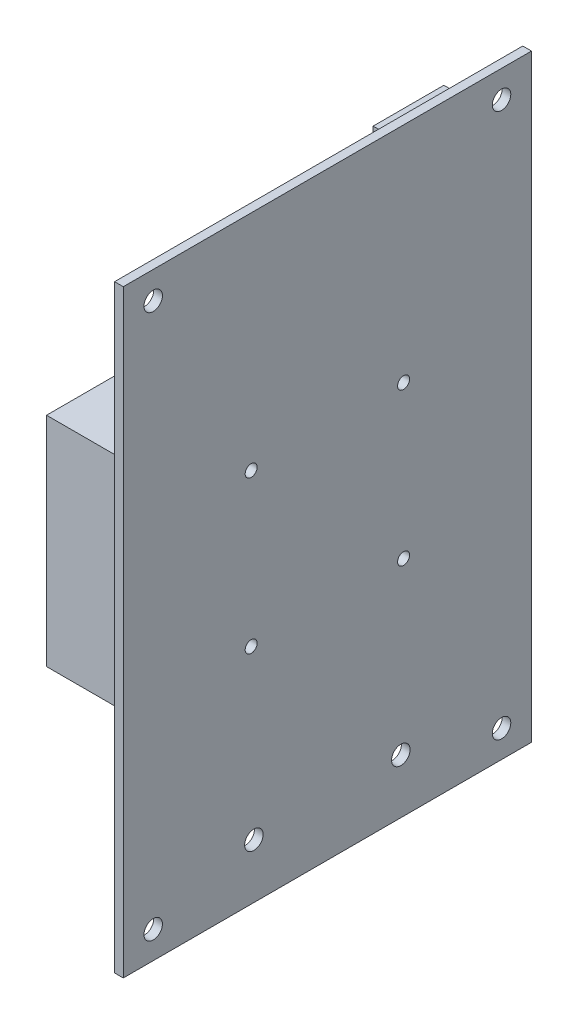
ISO-10303-21;
HEADER;
FILE_DESCRIPTION(('STEP AP214'),'2;1');
FILE_NAME('part.step','',(''),(''),'','','');
FILE_SCHEMA(('AUTOMOTIVE_DESIGN { 1 0 10303 214 1 1 1 1 }'));
ENDSEC;
DATA;
#1=APPLICATION_CONTEXT('core data for automotive mechanical design processes');
#2=APPLICATION_PROTOCOL_DEFINITION('international standard','automotive_design',2000,#1);
#3=PRODUCT_CONTEXT('',#1,'mechanical');
#4=PRODUCT('Part','Part','',(#3));
#5=PRODUCT_RELATED_PRODUCT_CATEGORY('part','',(#4));
#6=PRODUCT_DEFINITION_FORMATION('','',#4);
#7=PRODUCT_DEFINITION_CONTEXT('part definition',#1,'design');
#8=PRODUCT_DEFINITION('design','',#6,#7);
#9=PRODUCT_DEFINITION_SHAPE('','',#8);
#10=(LENGTH_UNIT() NAMED_UNIT(*) SI_UNIT(.MILLI.,.METRE.));
#11=(NAMED_UNIT(*) PLANE_ANGLE_UNIT() SI_UNIT($,.RADIAN.));
#12=(NAMED_UNIT(*) SI_UNIT($,.STERADIAN.) SOLID_ANGLE_UNIT());
#13=UNCERTAINTY_MEASURE_WITH_UNIT(LENGTH_MEASURE(1.E-05),#10,'distance_accuracy_value','');
#14=(GEOMETRIC_REPRESENTATION_CONTEXT(3) GLOBAL_UNCERTAINTY_ASSIGNED_CONTEXT((#13)) GLOBAL_UNIT_ASSIGNED_CONTEXT((#10,
#11,#12)) REPRESENTATION_CONTEXT('',''));
#15=CARTESIAN_POINT('',(0.,0.,0.));
#16=DIRECTION('',(0.,0.,1.));
#17=DIRECTION('',(1.,0.,0.));
#18=AXIS2_PLACEMENT_3D('',#15,#16,#17);
#19=CARTESIAN_POINT('',(-31.6,-55.,37.5));
#20=DIRECTION('',(0.,-1.,0.));
#21=DIRECTION('',(0.,0.,-1.));
#22=AXIS2_PLACEMENT_3D('',#19,#20,#21);
#23=PLANE('',#22);
#24=DIRECTION('',(0.,0.,-1.));
#25=VECTOR('',#24,1.);
#26=CARTESIAN_POINT('',(-30.,-55.,37.5));
#27=LINE('',#26,#25);
#28=CARTESIAN_POINT('',(-30.,-55.,37.5));
#29=VERTEX_POINT('',#28);
#30=CARTESIAN_POINT('',(-30.,-55.,-37.5));
#31=VERTEX_POINT('',#30);
#32=EDGE_CURVE('E314',#29,#31,#27,.T.);
#33=ORIENTED_EDGE('',*,*,#32,.F.);
#34=DIRECTION('',(1.,0.,0.));
#35=VECTOR('',#34,1.);
#36=CARTESIAN_POINT('',(-31.6,-55.,37.5));
#37=LINE('',#36,#35);
#38=CARTESIAN_POINT('',(-31.6,-55.,37.5));
#39=VERTEX_POINT('',#38);
#40=EDGE_CURVE('E11',#39,#29,#37,.T.);
#41=ORIENTED_EDGE('',*,*,#40,.F.);
#42=DIRECTION('',(0.,0.,-1.));
#43=VECTOR('',#42,1.);
#44=CARTESIAN_POINT('',(-31.6,-55.,37.5));
#45=LINE('',#44,#43);
#46=CARTESIAN_POINT('',(-31.6,-55.,-37.5));
#47=VERTEX_POINT('',#46);
#48=EDGE_CURVE('E319',#39,#47,#45,.T.);
#49=ORIENTED_EDGE('',*,*,#48,.T.);
#50=DIRECTION('',(1.,0.,0.));
#51=VECTOR('',#50,1.);
#52=CARTESIAN_POINT('',(-31.6,-55.,-37.5));
#53=LINE('',#52,#51);
#54=EDGE_CURVE('E42',#47,#31,#53,.T.);
#55=ORIENTED_EDGE('',*,*,#54,.T.);
#56=EDGE_LOOP('',(#33,#41,#49,#55));
#57=FACE_BOUND('',#56,.T.);
#58=ADVANCED_FACE('F41',(#57),#23,.T.);
#59=CARTESIAN_POINT('',(-31.6,55.,37.5));
#60=DIRECTION('',(0.,0.,1.));
#61=DIRECTION('',(1.,0.,0.));
#62=AXIS2_PLACEMENT_3D('',#59,#60,#61);
#63=PLANE('',#62);
#64=DIRECTION('',(0.,-1.,0.));
#65=VECTOR('',#64,1.);
#66=CARTESIAN_POINT('',(-30.,55.,37.5));
#67=LINE('',#66,#65);
#68=CARTESIAN_POINT('',(-30.,55.,37.5));
#69=VERTEX_POINT('',#68);
#70=EDGE_CURVE('E321',#69,#29,#67,.T.);
#71=ORIENTED_EDGE('',*,*,#70,.F.);
#72=DIRECTION('',(1.,0.,0.));
#73=VECTOR('',#72,1.);
#74=CARTESIAN_POINT('',(-31.6,55.,37.5));
#75=LINE('',#74,#73);
#76=CARTESIAN_POINT('',(-31.6,55.,37.5));
#77=VERTEX_POINT('',#76);
#78=EDGE_CURVE('E47',#77,#69,#75,.T.);
#79=ORIENTED_EDGE('',*,*,#78,.F.);
#80=DIRECTION('',(0.,-1.,0.));
#81=VECTOR('',#80,1.);
#82=CARTESIAN_POINT('',(-31.6,55.,37.5));
#83=LINE('',#82,#81);
#84=EDGE_CURVE('E327',#77,#39,#83,.T.);
#85=ORIENTED_EDGE('',*,*,#84,.T.);
#86=ORIENTED_EDGE('',*,*,#40,.T.);
#87=EDGE_LOOP('',(#71,#79,#85,#86));
#88=FACE_BOUND('',#87,.T.);
#89=ADVANCED_FACE('F354',(#88),#63,.T.);
#90=CARTESIAN_POINT('',(-31.6,55.,-37.5));
#91=DIRECTION('',(0.,1.,0.));
#92=DIRECTION('',(0.,0.,1.));
#93=AXIS2_PLACEMENT_3D('',#90,#91,#92);
#94=PLANE('',#93);
#95=DIRECTION('',(0.,0.,1.));
#96=VECTOR('',#95,1.);
#97=CARTESIAN_POINT('',(-30.,55.,-37.5));
#98=LINE('',#97,#96);
#99=CARTESIAN_POINT('',(-30.,55.,-37.5));
#100=VERTEX_POINT('',#99);
#101=EDGE_CURVE('E337',#100,#69,#98,.T.);
#102=ORIENTED_EDGE('',*,*,#101,.F.);
#103=DIRECTION('',(1.,0.,0.));
#104=VECTOR('',#103,1.);
#105=CARTESIAN_POINT('',(-31.6,55.,-37.5));
#106=LINE('',#105,#104);
#107=CARTESIAN_POINT('',(-31.6,55.,-37.5));
#108=VERTEX_POINT('',#107);
#109=EDGE_CURVE('E344',#108,#100,#106,.T.);
#110=ORIENTED_EDGE('',*,*,#109,.F.);
#111=DIRECTION('',(0.,0.,1.));
#112=VECTOR('',#111,1.);
#113=CARTESIAN_POINT('',(-31.6,55.,-37.5));
#114=LINE('',#113,#112);
#115=EDGE_CURVE('E322',#108,#77,#114,.T.);
#116=ORIENTED_EDGE('',*,*,#115,.T.);
#117=ORIENTED_EDGE('',*,*,#78,.T.);
#118=EDGE_LOOP('',(#102,#110,#116,#117));
#119=FACE_BOUND('',#118,.T.);
#120=ADVANCED_FACE('F359',(#119),#94,.T.);
#121=CARTESIAN_POINT('',(-31.6,-55.,-37.5));
#122=DIRECTION('',(0.,0.,-1.));
#123=DIRECTION('',(-1.,0.,0.));
#124=AXIS2_PLACEMENT_3D('',#121,#122,#123);
#125=PLANE('',#124);
#126=DIRECTION('',(0.,1.,0.));
#127=VECTOR('',#126,1.);
#128=CARTESIAN_POINT('',(-30.,-55.,-37.5));
#129=LINE('',#128,#127);
#130=EDGE_CURVE('E331',#31,#100,#129,.T.);
#131=ORIENTED_EDGE('',*,*,#130,.F.);
#132=ORIENTED_EDGE('',*,*,#54,.F.);
#133=DIRECTION('',(0.,1.,0.));
#134=VECTOR('',#133,1.);
#135=CARTESIAN_POINT('',(-31.6,-55.,-37.5));
#136=LINE('',#135,#134);
#137=EDGE_CURVE('E324',#47,#108,#136,.T.);
#138=ORIENTED_EDGE('',*,*,#137,.T.);
#139=ORIENTED_EDGE('',*,*,#109,.T.);
#140=EDGE_LOOP('',(#131,#132,#138,#139));
#141=FACE_BOUND('',#140,.T.);
#142=ADVANCED_FACE('F350',(#141),#125,.T.);
#143=CARTESIAN_POINT('',(-31.6,0.,0.));
#144=DIRECTION('',(1.,0.,0.));
#145=DIRECTION('',(0.,0.,-1.));
#146=AXIS2_PLACEMENT_3D('',#143,#144,#145);
#147=PLANE('',#146);
#148=DIRECTION('',(0.,-1.,0.));
#149=VECTOR('',#148,1.);
#150=CARTESIAN_POINT('',(-31.6,25.,35.));
#151=LINE('',#150,#149);
#152=CARTESIAN_POINT('',(-31.6,25.,35.));
#153=VERTEX_POINT('',#152);
#154=CARTESIAN_POINT('',(-31.6,-15.,35.));
#155=VERTEX_POINT('',#154);
#156=EDGE_CURVE('E177',#153,#155,#151,.T.);
#157=ORIENTED_EDGE('',*,*,#156,.T.);
#158=DIRECTION('',(0.,0.,-1.));
#159=VECTOR('',#158,1.);
#160=CARTESIAN_POINT('',(-31.6,-15.,35.));
#161=LINE('',#160,#159);
#162=CARTESIAN_POINT('',(-31.6,-15.,20.));
#163=VERTEX_POINT('',#162);
#164=EDGE_CURVE('E187',#155,#163,#161,.T.);
#165=ORIENTED_EDGE('',*,*,#164,.T.);
#166=DIRECTION('',(0.,1.,0.));
#167=VECTOR('',#166,1.);
#168=CARTESIAN_POINT('',(-31.6,-15.,20.));
#169=LINE('',#168,#167);
#170=CARTESIAN_POINT('',(-31.6,25.,20.));
#171=VERTEX_POINT('',#170);
#172=EDGE_CURVE('E159',#163,#171,#169,.T.);
#173=ORIENTED_EDGE('',*,*,#172,.T.);
#174=DIRECTION('',(0.,0.,1.));
#175=VECTOR('',#174,1.);
#176=CARTESIAN_POINT('',(-31.6,25.,20.));
#177=LINE('',#176,#175);
#178=EDGE_CURVE('E60',#171,#153,#177,.T.);
#179=ORIENTED_EDGE('',*,*,#178,.T.);
#180=EDGE_LOOP('',(#157,#165,#173,#179));
#181=FACE_BOUND('',#180,.T.);
#182=DIRECTION('',(0.,-1.,0.));
#183=VECTOR('',#182,1.);
#184=CARTESIAN_POINT('',(-31.6,53.,-13.));
#185=LINE('',#184,#183);
#186=CARTESIAN_POINT('',(-31.6,53.,-13.));
#187=VERTEX_POINT('',#186);
#188=CARTESIAN_POINT('',(-31.6,35.,-13.));
#189=VERTEX_POINT('',#188);
#190=EDGE_CURVE('E200',#187,#189,#185,.T.);
#191=ORIENTED_EDGE('',*,*,#190,.T.);
#192=DIRECTION('',(0.,0.,-1.));
#193=VECTOR('',#192,1.);
#194=CARTESIAN_POINT('',(-31.6,35.,-13.));
#195=LINE('',#194,#193);
#196=CARTESIAN_POINT('',(-31.6,35.,-26.));
#197=VERTEX_POINT('',#196);
#198=EDGE_CURVE('E194',#189,#197,#195,.T.);
#199=ORIENTED_EDGE('',*,*,#198,.T.);
#200=DIRECTION('',(0.,1.,0.));
#201=VECTOR('',#200,1.);
#202=CARTESIAN_POINT('',(-31.6,35.,-26.));
#203=LINE('',#202,#201);
#204=CARTESIAN_POINT('',(-31.6,53.,-26.));
#205=VERTEX_POINT('',#204);
#206=EDGE_CURVE('E214',#197,#205,#203,.T.);
#207=ORIENTED_EDGE('',*,*,#206,.T.);
#208=DIRECTION('',(0.,0.,1.));
#209=VECTOR('',#208,1.);
#210=CARTESIAN_POINT('',(-31.6,53.,-26.));
#211=LINE('',#210,#209);
#212=EDGE_CURVE('E62',#205,#187,#211,.T.);
#213=ORIENTED_EDGE('',*,*,#212,.T.);
#214=EDGE_LOOP('',(#191,#199,#207,#213));
#215=FACE_BOUND('',#214,.T.);
#216=DIRECTION('',(0.,-1.,0.));
#217=VECTOR('',#216,1.);
#218=CARTESIAN_POINT('',(-31.6,30.5,-19.));
#219=LINE('',#218,#217);
#220=CARTESIAN_POINT('',(-31.6,30.5,-19.));
#221=VERTEX_POINT('',#220);
#222=CARTESIAN_POINT('',(-31.6,-30.5,-19.));
#223=VERTEX_POINT('',#222);
#224=EDGE_CURVE('E230',#221,#223,#219,.T.);
#225=ORIENTED_EDGE('',*,*,#224,.T.);
#226=DIRECTION('',(0.,0.,-1.));
#227=VECTOR('',#226,1.);
#228=CARTESIAN_POINT('',(-31.6,-30.5,-19.));
#229=LINE('',#228,#227);
#230=CARTESIAN_POINT('',(-31.6,-30.5,-37.));
#231=VERTEX_POINT('',#230);
#232=EDGE_CURVE('E220',#223,#231,#229,.T.);
#233=ORIENTED_EDGE('',*,*,#232,.T.);
#234=DIRECTION('',(0.,1.,0.));
#235=VECTOR('',#234,1.);
#236=CARTESIAN_POINT('',(-31.6,-30.5,-37.));
#237=LINE('',#236,#235);
#238=CARTESIAN_POINT('',(-31.6,30.5,-37.));
#239=VERTEX_POINT('',#238);
#240=EDGE_CURVE('E241',#231,#239,#237,.T.);
#241=ORIENTED_EDGE('',*,*,#240,.T.);
#242=DIRECTION('',(0.,0.,1.));
#243=VECTOR('',#242,1.);
#244=CARTESIAN_POINT('',(-31.6,30.5,-37.));
#245=LINE('',#244,#243);
#246=EDGE_CURVE('E242',#239,#221,#245,.T.);
#247=ORIENTED_EDGE('',*,*,#246,.T.);
#248=EDGE_LOOP('',(#225,#233,#241,#247));
#249=FACE_BOUND('',#248,.T.);
#250=CARTESIAN_POINT('',(-31.6,14.,14.));
#251=DIRECTION('',(1.,0.,0.));
#252=DIRECTION('',(0.,0.,-1.));
#253=AXIS2_PLACEMENT_3D('',#250,#251,#252);
#254=CIRCLE('',#253,1.1);
#255=CARTESIAN_POINT('',(-31.6,14.,12.9));
#256=VERTEX_POINT('',#255);
#257=EDGE_CURVE('E260',#256,#256,#254,.T.);
#258=ORIENTED_EDGE('',*,*,#257,.T.);
#259=EDGE_LOOP('',(#258));
#260=FACE_BOUND('',#259,.T.);
#261=CARTESIAN_POINT('',(-31.6,14.,-14.));
#262=DIRECTION('',(1.,0.,0.));
#263=DIRECTION('',(0.,0.,-1.));
#264=AXIS2_PLACEMENT_3D('',#261,#262,#263);
#265=CIRCLE('',#264,1.1);
#266=CARTESIAN_POINT('',(-31.6,14.,-15.1));
#267=VERTEX_POINT('',#266);
#268=EDGE_CURVE('E265',#267,#267,#265,.T.);
#269=ORIENTED_EDGE('',*,*,#268,.T.);
#270=EDGE_LOOP('',(#269));
#271=FACE_BOUND('',#270,.T.);
#272=CARTESIAN_POINT('',(-31.6,-14.,14.));
#273=DIRECTION('',(1.,0.,0.));
#274=DIRECTION('',(0.,0.,-1.));
#275=AXIS2_PLACEMENT_3D('',#272,#273,#274);
#276=CIRCLE('',#275,1.1);
#277=CARTESIAN_POINT('',(-31.6,-14.,12.9));
#278=VERTEX_POINT('',#277);
#279=EDGE_CURVE('E267',#278,#278,#276,.T.);
#280=ORIENTED_EDGE('',*,*,#279,.T.);
#281=EDGE_LOOP('',(#280));
#282=FACE_BOUND('',#281,.T.);
#283=CARTESIAN_POINT('',(-31.6,-14.,-14.));
#284=DIRECTION('',(1.,0.,0.));
#285=DIRECTION('',(0.,0.,-1.));
#286=AXIS2_PLACEMENT_3D('',#283,#284,#285);
#287=CIRCLE('',#286,1.1);
#288=CARTESIAN_POINT('',(-31.6,-14.,-15.1));
#289=VERTEX_POINT('',#288);
#290=EDGE_CURVE('E279',#289,#289,#287,.T.);
#291=ORIENTED_EDGE('',*,*,#290,.T.);
#292=EDGE_LOOP('',(#291));
#293=FACE_BOUND('',#292,.T.);
#294=CARTESIAN_POINT('',(-31.6,-45.,13.5));
#295=DIRECTION('',(1.,0.,0.));
#296=DIRECTION('',(0.,0.,-1.));
#297=AXIS2_PLACEMENT_3D('',#294,#295,#296);
#298=CIRCLE('',#297,1.7);
#299=CARTESIAN_POINT('',(-31.6,-45.,11.8));
#300=VERTEX_POINT('',#299);
#301=EDGE_CURVE('E284',#300,#300,#298,.T.);
#302=ORIENTED_EDGE('',*,*,#301,.T.);
#303=EDGE_LOOP('',(#302));
#304=FACE_BOUND('',#303,.T.);
#305=CARTESIAN_POINT('',(-31.6,-45.,-13.5));
#306=DIRECTION('',(1.,0.,0.));
#307=DIRECTION('',(0.,0.,-1.));
#308=AXIS2_PLACEMENT_3D('',#305,#306,#307);
#309=CIRCLE('',#308,1.7);
#310=CARTESIAN_POINT('',(-31.6,-45.,-15.2));
#311=VERTEX_POINT('',#310);
#312=EDGE_CURVE('E286',#311,#311,#309,.T.);
#313=ORIENTED_EDGE('',*,*,#312,.T.);
#314=EDGE_LOOP('',(#313));
#315=FACE_BOUND('',#314,.T.);
#316=CARTESIAN_POINT('',(-31.6,50.,32.));
#317=DIRECTION('',(1.,0.,0.));
#318=DIRECTION('',(0.,0.,-1.));
#319=AXIS2_PLACEMENT_3D('',#316,#317,#318);
#320=CIRCLE('',#319,1.7);
#321=CARTESIAN_POINT('',(-31.6,50.,30.3));
#322=VERTEX_POINT('',#321);
#323=EDGE_CURVE('E295',#322,#322,#320,.T.);
#324=ORIENTED_EDGE('',*,*,#323,.T.);
#325=EDGE_LOOP('',(#324));
#326=FACE_BOUND('',#325,.T.);
#327=CARTESIAN_POINT('',(-31.6,50.,-32.));
#328=DIRECTION('',(1.,0.,0.));
#329=DIRECTION('',(0.,0.,-1.));
#330=AXIS2_PLACEMENT_3D('',#327,#328,#329);
#331=CIRCLE('',#330,1.7);
#332=CARTESIAN_POINT('',(-31.6,50.,-33.7));
#333=VERTEX_POINT('',#332);
#334=EDGE_CURVE('E297',#333,#333,#331,.T.);
#335=ORIENTED_EDGE('',*,*,#334,.T.);
#336=EDGE_LOOP('',(#335));
#337=FACE_BOUND('',#336,.T.);
#338=CARTESIAN_POINT('',(-31.6,-50.,32.));
#339=DIRECTION('',(1.,0.,0.));
#340=DIRECTION('',(0.,0.,-1.));
#341=AXIS2_PLACEMENT_3D('',#338,#339,#340);
#342=CIRCLE('',#341,1.7);
#343=CARTESIAN_POINT('',(-31.6,-50.,30.3));
#344=VERTEX_POINT('',#343);
#345=EDGE_CURVE('E306',#344,#344,#342,.T.);
#346=ORIENTED_EDGE('',*,*,#345,.T.);
#347=EDGE_LOOP('',(#346));
#348=FACE_BOUND('',#347,.T.);
#349=CARTESIAN_POINT('',(-31.6,-50.,-32.));
#350=DIRECTION('',(1.,0.,0.));
#351=DIRECTION('',(0.,0.,-1.));
#352=AXIS2_PLACEMENT_3D('',#349,#350,#351);
#353=CIRCLE('',#352,1.7);
#354=CARTESIAN_POINT('',(-31.6,-50.,-33.7));
#355=VERTEX_POINT('',#354);
#356=EDGE_CURVE('E315',#355,#355,#353,.T.);
#357=ORIENTED_EDGE('',*,*,#356,.T.);
#358=EDGE_LOOP('',(#357));
#359=FACE_BOUND('',#358,.T.);
#360=ORIENTED_EDGE('',*,*,#48,.F.);
#361=ORIENTED_EDGE('',*,*,#84,.F.);
#362=ORIENTED_EDGE('',*,*,#115,.F.);
#363=ORIENTED_EDGE('',*,*,#137,.F.);
#364=EDGE_LOOP('',(#360,#361,#362,#363));
#365=FACE_BOUND('',#364,.T.);
#366=ADVANCED_FACE('F357',(#181,#215,#249,#260,#271,#282,#293,#304,#315,#326,#337,#348,#359,
#365),#147,.F.);
#367=CARTESIAN_POINT('',(-30.,0.,0.));
#368=DIRECTION('',(1.,0.,0.));
#369=DIRECTION('',(0.,0.,-1.));
#370=AXIS2_PLACEMENT_3D('',#367,#368,#369);
#371=PLANE('',#370);
#372=CARTESIAN_POINT('',(-30.,14.,14.));
#373=DIRECTION('',(1.,0.,0.));
#374=DIRECTION('',(0.,0.,-1.));
#375=AXIS2_PLACEMENT_3D('',#372,#373,#374);
#376=CIRCLE('',#375,1.1);
#377=CARTESIAN_POINT('',(-30.,14.,12.9));
#378=VERTEX_POINT('',#377);
#379=EDGE_CURVE('E255',#378,#378,#376,.T.);
#380=ORIENTED_EDGE('',*,*,#379,.F.);
#381=EDGE_LOOP('',(#380));
#382=FACE_BOUND('',#381,.T.);
#383=CARTESIAN_POINT('',(-30.,14.,-14.));
#384=DIRECTION('',(1.,0.,0.));
#385=DIRECTION('',(0.,0.,-1.));
#386=AXIS2_PLACEMENT_3D('',#383,#384,#385);
#387=CIRCLE('',#386,1.1);
#388=CARTESIAN_POINT('',(-30.,14.,-15.1));
#389=VERTEX_POINT('',#388);
#390=EDGE_CURVE('E263',#389,#389,#387,.T.);
#391=ORIENTED_EDGE('',*,*,#390,.F.);
#392=EDGE_LOOP('',(#391));
#393=FACE_BOUND('',#392,.T.);
#394=CARTESIAN_POINT('',(-30.,-14.,14.));
#395=DIRECTION('',(1.,0.,0.));
#396=DIRECTION('',(0.,0.,-1.));
#397=AXIS2_PLACEMENT_3D('',#394,#395,#396);
#398=CIRCLE('',#397,1.1);
#399=CARTESIAN_POINT('',(-30.,-14.,12.9));
#400=VERTEX_POINT('',#399);
#401=EDGE_CURVE('E270',#400,#400,#398,.T.);
#402=ORIENTED_EDGE('',*,*,#401,.F.);
#403=EDGE_LOOP('',(#402));
#404=FACE_BOUND('',#403,.T.);
#405=CARTESIAN_POINT('',(-30.,-14.,-14.));
#406=DIRECTION('',(1.,0.,0.));
#407=DIRECTION('',(0.,0.,-1.));
#408=AXIS2_PLACEMENT_3D('',#405,#406,#407);
#409=CIRCLE('',#408,1.1);
#410=CARTESIAN_POINT('',(-30.,-14.,-15.1));
#411=VERTEX_POINT('',#410);
#412=EDGE_CURVE('E271',#411,#411,#409,.T.);
#413=ORIENTED_EDGE('',*,*,#412,.F.);
#414=EDGE_LOOP('',(#413));
#415=FACE_BOUND('',#414,.T.);
#416=CARTESIAN_POINT('',(-30.,-45.,13.5));
#417=DIRECTION('',(1.,0.,0.));
#418=DIRECTION('',(0.,0.,-1.));
#419=AXIS2_PLACEMENT_3D('',#416,#417,#418);
#420=CIRCLE('',#419,1.7);
#421=CARTESIAN_POINT('',(-30.,-45.,11.8));
#422=VERTEX_POINT('',#421);
#423=EDGE_CURVE('E278',#422,#422,#420,.T.);
#424=ORIENTED_EDGE('',*,*,#423,.F.);
#425=EDGE_LOOP('',(#424));
#426=FACE_BOUND('',#425,.T.);
#427=CARTESIAN_POINT('',(-30.,-45.,-13.5));
#428=DIRECTION('',(1.,0.,0.));
#429=DIRECTION('',(0.,0.,-1.));
#430=AXIS2_PLACEMENT_3D('',#427,#428,#429);
#431=CIRCLE('',#430,1.7);
#432=CARTESIAN_POINT('',(-30.,-45.,-15.2));
#433=VERTEX_POINT('',#432);
#434=EDGE_CURVE('E281',#433,#433,#431,.T.);
#435=ORIENTED_EDGE('',*,*,#434,.F.);
#436=EDGE_LOOP('',(#435));
#437=FACE_BOUND('',#436,.T.);
#438=CARTESIAN_POINT('',(-30.,50.,32.));
#439=DIRECTION('',(1.,0.,0.));
#440=DIRECTION('',(0.,0.,-1.));
#441=AXIS2_PLACEMENT_3D('',#438,#439,#440);
#442=CIRCLE('',#441,1.7);
#443=CARTESIAN_POINT('',(-30.,50.,30.3));
#444=VERTEX_POINT('',#443);
#445=EDGE_CURVE('E293',#444,#444,#442,.T.);
#446=ORIENTED_EDGE('',*,*,#445,.F.);
#447=EDGE_LOOP('',(#446));
#448=FACE_BOUND('',#447,.T.);
#449=CARTESIAN_POINT('',(-30.,50.,-32.));
#450=DIRECTION('',(1.,0.,0.));
#451=DIRECTION('',(0.,0.,-1.));
#452=AXIS2_PLACEMENT_3D('',#449,#450,#451);
#453=CIRCLE('',#452,1.7);
#454=CARTESIAN_POINT('',(-30.,50.,-33.7));
#455=VERTEX_POINT('',#454);
#456=EDGE_CURVE('E300',#455,#455,#453,.T.);
#457=ORIENTED_EDGE('',*,*,#456,.F.);
#458=EDGE_LOOP('',(#457));
#459=FACE_BOUND('',#458,.T.);
#460=CARTESIAN_POINT('',(-30.,-50.,32.));
#461=DIRECTION('',(1.,0.,0.));
#462=DIRECTION('',(0.,0.,-1.));
#463=AXIS2_PLACEMENT_3D('',#460,#461,#462);
#464=CIRCLE('',#463,1.7);
#465=CARTESIAN_POINT('',(-30.,-50.,30.3));
#466=VERTEX_POINT('',#465);
#467=EDGE_CURVE('E303',#466,#466,#464,.T.);
#468=ORIENTED_EDGE('',*,*,#467,.F.);
#469=EDGE_LOOP('',(#468));
#470=FACE_BOUND('',#469,.T.);
#471=CARTESIAN_POINT('',(-30.,-50.,-32.));
#472=DIRECTION('',(1.,0.,0.));
#473=DIRECTION('',(0.,0.,-1.));
#474=AXIS2_PLACEMENT_3D('',#471,#472,#473);
#475=CIRCLE('',#474,1.7);
#476=CARTESIAN_POINT('',(-30.,-50.,-33.7));
#477=VERTEX_POINT('',#476);
#478=EDGE_CURVE('E307',#477,#477,#475,.T.);
#479=ORIENTED_EDGE('',*,*,#478,.F.);
#480=EDGE_LOOP('',(#479));
#481=FACE_BOUND('',#480,.T.);
#482=ORIENTED_EDGE('',*,*,#32,.T.);
#483=ORIENTED_EDGE('',*,*,#130,.T.);
#484=ORIENTED_EDGE('',*,*,#101,.T.);
#485=ORIENTED_EDGE('',*,*,#70,.T.);
#486=EDGE_LOOP('',(#482,#483,#484,#485));
#487=FACE_BOUND('',#486,.T.);
#488=ADVANCED_FACE('F353',(#382,#393,#404,#415,#426,#437,#448,#459,#470,#481,#487),#371,.T.);
#489=CARTESIAN_POINT('',(-31.6,-50.,-32.));
#490=DIRECTION('',(1.,0.,0.));
#491=DIRECTION('',(0.,0.,-1.));
#492=AXIS2_PLACEMENT_3D('',#489,#490,#491);
#493=CYLINDRICAL_SURFACE('',#492,1.7);
#494=ORIENTED_EDGE('',*,*,#356,.F.);
#495=EDGE_LOOP('',(#494));
#496=FACE_BOUND('',#495,.T.);
#497=ORIENTED_EDGE('',*,*,#478,.T.);
#498=EDGE_LOOP('',(#497));
#499=FACE_BOUND('',#498,.T.);
#500=ADVANCED_FACE('F406',(#496,#499),#493,.F.);
#501=CARTESIAN_POINT('',(-31.6,-50.,32.));
#502=DIRECTION('',(1.,0.,0.));
#503=DIRECTION('',(0.,0.,-1.));
#504=AXIS2_PLACEMENT_3D('',#501,#502,#503);
#505=CYLINDRICAL_SURFACE('',#504,1.7);
#506=ORIENTED_EDGE('',*,*,#345,.F.);
#507=EDGE_LOOP('',(#506));
#508=FACE_BOUND('',#507,.T.);
#509=ORIENTED_EDGE('',*,*,#467,.T.);
#510=EDGE_LOOP('',(#509));
#511=FACE_BOUND('',#510,.T.);
#512=ADVANCED_FACE('F420',(#508,#511),#505,.F.);
#513=CARTESIAN_POINT('',(-31.6,50.,-32.));
#514=DIRECTION('',(1.,0.,0.));
#515=DIRECTION('',(0.,0.,-1.));
#516=AXIS2_PLACEMENT_3D('',#513,#514,#515);
#517=CYLINDRICAL_SURFACE('',#516,1.7);
#518=ORIENTED_EDGE('',*,*,#334,.F.);
#519=EDGE_LOOP('',(#518));
#520=FACE_BOUND('',#519,.T.);
#521=ORIENTED_EDGE('',*,*,#456,.T.);
#522=EDGE_LOOP('',(#521));
#523=FACE_BOUND('',#522,.T.);
#524=ADVANCED_FACE('F430',(#520,#523),#517,.F.);
#525=CARTESIAN_POINT('',(-31.6,50.,32.));
#526=DIRECTION('',(1.,0.,0.));
#527=DIRECTION('',(0.,0.,-1.));
#528=AXIS2_PLACEMENT_3D('',#525,#526,#527);
#529=CYLINDRICAL_SURFACE('',#528,1.7);
#530=ORIENTED_EDGE('',*,*,#323,.F.);
#531=EDGE_LOOP('',(#530));
#532=FACE_BOUND('',#531,.T.);
#533=ORIENTED_EDGE('',*,*,#445,.T.);
#534=EDGE_LOOP('',(#533));
#535=FACE_BOUND('',#534,.T.);
#536=ADVANCED_FACE('F440',(#532,#535),#529,.F.);
#537=CARTESIAN_POINT('',(-31.6,-45.,-13.5));
#538=DIRECTION('',(1.,0.,0.));
#539=DIRECTION('',(0.,0.,-1.));
#540=AXIS2_PLACEMENT_3D('',#537,#538,#539);
#541=CYLINDRICAL_SURFACE('',#540,1.7);
#542=ORIENTED_EDGE('',*,*,#312,.F.);
#543=EDGE_LOOP('',(#542));
#544=FACE_BOUND('',#543,.T.);
#545=ORIENTED_EDGE('',*,*,#434,.T.);
#546=EDGE_LOOP('',(#545));
#547=FACE_BOUND('',#546,.T.);
#548=ADVANCED_FACE('F450',(#544,#547),#541,.F.);
#549=CARTESIAN_POINT('',(-31.6,-45.,13.5));
#550=DIRECTION('',(1.,0.,0.));
#551=DIRECTION('',(0.,0.,-1.));
#552=AXIS2_PLACEMENT_3D('',#549,#550,#551);
#553=CYLINDRICAL_SURFACE('',#552,1.7);
#554=ORIENTED_EDGE('',*,*,#301,.F.);
#555=EDGE_LOOP('',(#554));
#556=FACE_BOUND('',#555,.T.);
#557=ORIENTED_EDGE('',*,*,#423,.T.);
#558=EDGE_LOOP('',(#557));
#559=FACE_BOUND('',#558,.T.);
#560=ADVANCED_FACE('F459',(#556,#559),#553,.F.);
#561=CARTESIAN_POINT('',(-31.6,-14.,-14.));
#562=DIRECTION('',(1.,0.,0.));
#563=DIRECTION('',(0.,0.,-1.));
#564=AXIS2_PLACEMENT_3D('',#561,#562,#563);
#565=CYLINDRICAL_SURFACE('',#564,1.1);
#566=ORIENTED_EDGE('',*,*,#290,.F.);
#567=EDGE_LOOP('',(#566));
#568=FACE_BOUND('',#567,.T.);
#569=ORIENTED_EDGE('',*,*,#412,.T.);
#570=EDGE_LOOP('',(#569));
#571=FACE_BOUND('',#570,.T.);
#572=ADVANCED_FACE('F470',(#568,#571),#565,.F.);
#573=CARTESIAN_POINT('',(-31.6,-14.,14.));
#574=DIRECTION('',(1.,0.,0.));
#575=DIRECTION('',(0.,0.,-1.));
#576=AXIS2_PLACEMENT_3D('',#573,#574,#575);
#577=CYLINDRICAL_SURFACE('',#576,1.1);
#578=ORIENTED_EDGE('',*,*,#279,.F.);
#579=EDGE_LOOP('',(#578));
#580=FACE_BOUND('',#579,.T.);
#581=ORIENTED_EDGE('',*,*,#401,.T.);
#582=EDGE_LOOP('',(#581));
#583=FACE_BOUND('',#582,.T.);
#584=ADVANCED_FACE('F479',(#580,#583),#577,.F.);
#585=CARTESIAN_POINT('',(-31.6,14.,-14.));
#586=DIRECTION('',(1.,0.,0.));
#587=DIRECTION('',(0.,0.,-1.));
#588=AXIS2_PLACEMENT_3D('',#585,#586,#587);
#589=CYLINDRICAL_SURFACE('',#588,1.1);
#590=ORIENTED_EDGE('',*,*,#268,.F.);
#591=EDGE_LOOP('',(#590));
#592=FACE_BOUND('',#591,.T.);
#593=ORIENTED_EDGE('',*,*,#390,.T.);
#594=EDGE_LOOP('',(#593));
#595=FACE_BOUND('',#594,.T.);
#596=ADVANCED_FACE('F487',(#592,#595),#589,.F.);
#597=CARTESIAN_POINT('',(-31.6,14.,14.));
#598=DIRECTION('',(1.,0.,0.));
#599=DIRECTION('',(0.,0.,-1.));
#600=AXIS2_PLACEMENT_3D('',#597,#598,#599);
#601=CYLINDRICAL_SURFACE('',#600,1.1);
#602=ORIENTED_EDGE('',*,*,#257,.F.);
#603=EDGE_LOOP('',(#602));
#604=FACE_BOUND('',#603,.T.);
#605=ORIENTED_EDGE('',*,*,#379,.T.);
#606=EDGE_LOOP('',(#605));
#607=FACE_BOUND('',#606,.T.);
#608=ADVANCED_FACE('F500',(#604,#607),#601,.F.);
#609=CARTESIAN_POINT('',(-36.6,-30.5,-19.));
#610=DIRECTION('',(0.,-1.,0.));
#611=DIRECTION('',(0.,0.,-1.));
#612=AXIS2_PLACEMENT_3D('',#609,#610,#611);
#613=PLANE('',#612);
#614=ORIENTED_EDGE('',*,*,#232,.F.);
#615=DIRECTION('',(1.,0.,0.));
#616=VECTOR('',#615,1.);
#617=CARTESIAN_POINT('',(-36.6,-30.5,-19.));
#618=LINE('',#617,#616);
#619=CARTESIAN_POINT('',(-36.6,-30.5,-19.));
#620=VERTEX_POINT('',#619);
#621=EDGE_CURVE('E248',#620,#223,#618,.T.);
#622=ORIENTED_EDGE('',*,*,#621,.F.);
#623=DIRECTION('',(0.,0.,-1.));
#624=VECTOR('',#623,1.);
#625=CARTESIAN_POINT('',(-36.6,-30.5,-19.));
#626=LINE('',#625,#624);
#627=CARTESIAN_POINT('',(-36.6,-30.5,-37.));
#628=VERTEX_POINT('',#627);
#629=EDGE_CURVE('E222',#620,#628,#626,.T.);
#630=ORIENTED_EDGE('',*,*,#629,.T.);
#631=DIRECTION('',(1.,0.,0.));
#632=VECTOR('',#631,1.);
#633=CARTESIAN_POINT('',(-36.6,-30.5,-37.));
#634=LINE('',#633,#632);
#635=EDGE_CURVE('E238',#628,#231,#634,.T.);
#636=ORIENTED_EDGE('',*,*,#635,.T.);
#637=EDGE_LOOP('',(#614,#622,#630,#636));
#638=FACE_BOUND('',#637,.T.);
#639=ADVANCED_FACE('F510',(#638),#613,.T.);
#640=CARTESIAN_POINT('',(-36.6,30.5,-19.));
#641=DIRECTION('',(0.,0.,1.));
#642=DIRECTION('',(1.,0.,0.));
#643=AXIS2_PLACEMENT_3D('',#640,#641,#642);
#644=PLANE('',#643);
#645=ORIENTED_EDGE('',*,*,#224,.F.);
#646=DIRECTION('',(1.,0.,0.));
#647=VECTOR('',#646,1.);
#648=CARTESIAN_POINT('',(-36.6,30.5,-19.));
#649=LINE('',#648,#647);
#650=CARTESIAN_POINT('',(-36.6,30.5,-19.));
#651=VERTEX_POINT('',#650);
#652=EDGE_CURVE('E254',#651,#221,#649,.T.);
#653=ORIENTED_EDGE('',*,*,#652,.F.);
#654=DIRECTION('',(0.,-1.,0.));
#655=VECTOR('',#654,1.);
#656=CARTESIAN_POINT('',(-36.6,30.5,-19.));
#657=LINE('',#656,#655);
#658=EDGE_CURVE('E232',#651,#620,#657,.T.);
#659=ORIENTED_EDGE('',*,*,#658,.T.);
#660=ORIENTED_EDGE('',*,*,#621,.T.);
#661=EDGE_LOOP('',(#645,#653,#659,#660));
#662=FACE_BOUND('',#661,.T.);
#663=ADVANCED_FACE('F516',(#662),#644,.T.);
#664=CARTESIAN_POINT('',(-36.6,30.5,-37.));
#665=DIRECTION('',(0.,1.,0.));
#666=DIRECTION('',(0.,0.,1.));
#667=AXIS2_PLACEMENT_3D('',#664,#665,#666);
#668=PLANE('',#667);
#669=ORIENTED_EDGE('',*,*,#246,.F.);
#670=DIRECTION('',(1.,0.,0.));
#671=VECTOR('',#670,1.);
#672=CARTESIAN_POINT('',(-36.6,30.5,-37.));
#673=LINE('',#672,#671);
#674=CARTESIAN_POINT('',(-36.6,30.5,-37.));
#675=VERTEX_POINT('',#674);
#676=EDGE_CURVE('E253',#675,#239,#673,.T.);
#677=ORIENTED_EDGE('',*,*,#676,.F.);
#678=DIRECTION('',(0.,0.,1.));
#679=VECTOR('',#678,1.);
#680=CARTESIAN_POINT('',(-36.6,30.5,-37.));
#681=LINE('',#680,#679);
#682=EDGE_CURVE('E235',#675,#651,#681,.T.);
#683=ORIENTED_EDGE('',*,*,#682,.T.);
#684=ORIENTED_EDGE('',*,*,#652,.T.);
#685=EDGE_LOOP('',(#669,#677,#683,#684));
#686=FACE_BOUND('',#685,.T.);
#687=ADVANCED_FACE('F530',(#686),#668,.T.);
#688=CARTESIAN_POINT('',(-36.6,-30.5,-37.));
#689=DIRECTION('',(0.,0.,-1.));
#690=DIRECTION('',(-1.,0.,0.));
#691=AXIS2_PLACEMENT_3D('',#688,#689,#690);
#692=PLANE('',#691);
#693=ORIENTED_EDGE('',*,*,#240,.F.);
#694=ORIENTED_EDGE('',*,*,#635,.F.);
#695=DIRECTION('',(0.,1.,0.));
#696=VECTOR('',#695,1.);
#697=CARTESIAN_POINT('',(-36.6,-30.5,-37.));
#698=LINE('',#697,#696);
#699=EDGE_CURVE('E226',#628,#675,#698,.T.);
#700=ORIENTED_EDGE('',*,*,#699,.T.);
#701=ORIENTED_EDGE('',*,*,#676,.T.);
#702=EDGE_LOOP('',(#693,#694,#700,#701));
#703=FACE_BOUND('',#702,.T.);
#704=ADVANCED_FACE('F536',(#703),#692,.T.);
#705=CARTESIAN_POINT('',(-36.6,0.,0.));
#706=DIRECTION('',(1.,0.,0.));
#707=DIRECTION('',(0.,0.,-1.));
#708=AXIS2_PLACEMENT_3D('',#705,#706,#707);
#709=PLANE('',#708);
#710=ORIENTED_EDGE('',*,*,#629,.F.);
#711=ORIENTED_EDGE('',*,*,#658,.F.);
#712=ORIENTED_EDGE('',*,*,#682,.F.);
#713=ORIENTED_EDGE('',*,*,#699,.F.);
#714=EDGE_LOOP('',(#710,#711,#712,#713));
#715=FACE_BOUND('',#714,.T.);
#716=ADVANCED_FACE('F550',(#715),#709,.F.);
#717=CARTESIAN_POINT('',(-34.6,35.,-13.));
#718=DIRECTION('',(0.,-1.,0.));
#719=DIRECTION('',(0.,0.,-1.));
#720=AXIS2_PLACEMENT_3D('',#717,#718,#719);
#721=PLANE('',#720);
#722=ORIENTED_EDGE('',*,*,#198,.F.);
#723=DIRECTION('',(1.,0.,0.));
#724=VECTOR('',#723,1.);
#725=CARTESIAN_POINT('',(-34.6,35.,-13.));
#726=LINE('',#725,#724);
#727=CARTESIAN_POINT('',(-34.6,35.,-13.));
#728=VERTEX_POINT('',#727);
#729=EDGE_CURVE('E219',#728,#189,#726,.T.);
#730=ORIENTED_EDGE('',*,*,#729,.F.);
#731=DIRECTION('',(0.,0.,-1.));
#732=VECTOR('',#731,1.);
#733=CARTESIAN_POINT('',(-34.6,35.,-13.));
#734=LINE('',#733,#732);
#735=CARTESIAN_POINT('',(-34.6,35.,-26.));
#736=VERTEX_POINT('',#735);
#737=EDGE_CURVE('E192',#728,#736,#734,.T.);
#738=ORIENTED_EDGE('',*,*,#737,.T.);
#739=DIRECTION('',(1.,0.,0.));
#740=VECTOR('',#739,1.);
#741=CARTESIAN_POINT('',(-34.6,35.,-26.));
#742=LINE('',#741,#740);
#743=EDGE_CURVE('E206',#736,#197,#742,.T.);
#744=ORIENTED_EDGE('',*,*,#743,.T.);
#745=EDGE_LOOP('',(#722,#730,#738,#744));
#746=FACE_BOUND('',#745,.T.);
#747=ADVANCED_FACE('F560',(#746),#721,.T.);
#748=CARTESIAN_POINT('',(-34.6,53.,-13.));
#749=DIRECTION('',(0.,0.,1.));
#750=DIRECTION('',(1.,0.,0.));
#751=AXIS2_PLACEMENT_3D('',#748,#749,#750);
#752=PLANE('',#751);
#753=ORIENTED_EDGE('',*,*,#190,.F.);
#754=DIRECTION('',(1.,0.,0.));
#755=VECTOR('',#754,1.);
#756=CARTESIAN_POINT('',(-34.6,53.,-13.));
#757=LINE('',#756,#755);
#758=CARTESIAN_POINT('',(-34.6,53.,-13.));
#759=VERTEX_POINT('',#758);
#760=EDGE_CURVE('E216',#759,#187,#757,.T.);
#761=ORIENTED_EDGE('',*,*,#760,.F.);
#762=DIRECTION('',(0.,-1.,0.));
#763=VECTOR('',#762,1.);
#764=CARTESIAN_POINT('',(-34.6,53.,-13.));
#765=LINE('',#764,#763);
#766=EDGE_CURVE('E202',#759,#728,#765,.T.);
#767=ORIENTED_EDGE('',*,*,#766,.T.);
#768=ORIENTED_EDGE('',*,*,#729,.T.);
#769=EDGE_LOOP('',(#753,#761,#767,#768));
#770=FACE_BOUND('',#769,.T.);
#771=ADVANCED_FACE('F570',(#770),#752,.T.);
#772=CARTESIAN_POINT('',(-34.6,53.,-26.));
#773=DIRECTION('',(0.,1.,0.));
#774=DIRECTION('',(0.,0.,1.));
#775=AXIS2_PLACEMENT_3D('',#772,#773,#774);
#776=PLANE('',#775);
#777=ORIENTED_EDGE('',*,*,#212,.F.);
#778=DIRECTION('',(1.,0.,0.));
#779=VECTOR('',#778,1.);
#780=CARTESIAN_POINT('',(-34.6,53.,-26.));
#781=LINE('',#780,#779);
#782=CARTESIAN_POINT('',(-34.6,53.,-26.));
#783=VERTEX_POINT('',#782);
#784=EDGE_CURVE('E225',#783,#205,#781,.T.);
#785=ORIENTED_EDGE('',*,*,#784,.F.);
#786=DIRECTION('',(0.,0.,1.));
#787=VECTOR('',#786,1.);
#788=CARTESIAN_POINT('',(-34.6,53.,-26.));
#789=LINE('',#788,#787);
#790=EDGE_CURVE('E205',#783,#759,#789,.T.);
#791=ORIENTED_EDGE('',*,*,#790,.T.);
#792=ORIENTED_EDGE('',*,*,#760,.T.);
#793=EDGE_LOOP('',(#777,#785,#791,#792));
#794=FACE_BOUND('',#793,.T.);
#795=ADVANCED_FACE('F580',(#794),#776,.T.);
#796=CARTESIAN_POINT('',(-34.6,35.,-26.));
#797=DIRECTION('',(0.,0.,-1.));
#798=DIRECTION('',(-1.,0.,0.));
#799=AXIS2_PLACEMENT_3D('',#796,#797,#798);
#800=PLANE('',#799);
#801=ORIENTED_EDGE('',*,*,#206,.F.);
#802=ORIENTED_EDGE('',*,*,#743,.F.);
#803=DIRECTION('',(0.,1.,0.));
#804=VECTOR('',#803,1.);
#805=CARTESIAN_POINT('',(-34.6,35.,-26.));
#806=LINE('',#805,#804);
#807=EDGE_CURVE('E197',#736,#783,#806,.T.);
#808=ORIENTED_EDGE('',*,*,#807,.T.);
#809=ORIENTED_EDGE('',*,*,#784,.T.);
#810=EDGE_LOOP('',(#801,#802,#808,#809));
#811=FACE_BOUND('',#810,.T.);
#812=ADVANCED_FACE('F589',(#811),#800,.T.);
#813=CARTESIAN_POINT('',(-34.6,0.,0.));
#814=DIRECTION('',(1.,0.,0.));
#815=DIRECTION('',(0.,0.,-1.));
#816=AXIS2_PLACEMENT_3D('',#813,#814,#815);
#817=PLANE('',#816);
#818=ORIENTED_EDGE('',*,*,#737,.F.);
#819=ORIENTED_EDGE('',*,*,#766,.F.);
#820=ORIENTED_EDGE('',*,*,#790,.F.);
#821=ORIENTED_EDGE('',*,*,#807,.F.);
#822=EDGE_LOOP('',(#818,#819,#820,#821));
#823=FACE_BOUND('',#822,.T.);
#824=ADVANCED_FACE('F597',(#823),#817,.F.);
#825=CARTESIAN_POINT('',(-46.6,-15.,35.));
#826=DIRECTION('',(0.,-1.,0.));
#827=DIRECTION('',(0.,0.,-1.));
#828=AXIS2_PLACEMENT_3D('',#825,#826,#827);
#829=PLANE('',#828);
#830=ORIENTED_EDGE('',*,*,#164,.F.);
#831=DIRECTION('',(1.,0.,0.));
#832=VECTOR('',#831,1.);
#833=CARTESIAN_POINT('',(-46.6,-15.,35.));
#834=LINE('',#833,#832);
#835=CARTESIAN_POINT('',(-46.6,-15.,35.));
#836=VERTEX_POINT('',#835);
#837=EDGE_CURVE('E178',#836,#155,#834,.T.);
#838=ORIENTED_EDGE('',*,*,#837,.F.);
#839=DIRECTION('',(0.,0.,-1.));
#840=VECTOR('',#839,1.);
#841=CARTESIAN_POINT('',(-46.6,-15.,35.));
#842=LINE('',#841,#840);
#843=CARTESIAN_POINT('',(-46.6,-15.,20.));
#844=VERTEX_POINT('',#843);
#845=EDGE_CURVE('E175',#836,#844,#842,.T.);
#846=ORIENTED_EDGE('',*,*,#845,.T.);
#847=DIRECTION('',(1.,0.,0.));
#848=VECTOR('',#847,1.);
#849=CARTESIAN_POINT('',(-46.6,-15.,20.));
#850=LINE('',#849,#848);
#851=EDGE_CURVE('E155',#844,#163,#850,.T.);
#852=ORIENTED_EDGE('',*,*,#851,.T.);
#853=EDGE_LOOP('',(#830,#838,#846,#852));
#854=FACE_BOUND('',#853,.T.);
#855=ADVANCED_FACE('F180',(#854),#829,.T.);
#856=CARTESIAN_POINT('',(-46.6,25.,35.));
#857=DIRECTION('',(0.,0.,1.));
#858=DIRECTION('',(1.,0.,0.));
#859=AXIS2_PLACEMENT_3D('',#856,#857,#858);
#860=PLANE('',#859);
#861=ORIENTED_EDGE('',*,*,#156,.F.);
#862=DIRECTION('',(1.,0.,0.));
#863=VECTOR('',#862,1.);
#864=CARTESIAN_POINT('',(-46.6,25.,35.));
#865=LINE('',#864,#863);
#866=CARTESIAN_POINT('',(-46.6,25.,35.));
#867=VERTEX_POINT('',#866);
#868=EDGE_CURVE('E191',#867,#153,#865,.T.);
#869=ORIENTED_EDGE('',*,*,#868,.F.);
#870=DIRECTION('',(0.,-1.,0.));
#871=VECTOR('',#870,1.);
#872=CARTESIAN_POINT('',(-46.6,25.,35.));
#873=LINE('',#872,#871);
#874=EDGE_CURVE('E164',#867,#836,#873,.T.);
#875=ORIENTED_EDGE('',*,*,#874,.T.);
#876=ORIENTED_EDGE('',*,*,#837,.T.);
#877=EDGE_LOOP('',(#861,#869,#875,#876));
#878=FACE_BOUND('',#877,.T.);
#879=ADVANCED_FACE('F611',(#878),#860,.T.);
#880=CARTESIAN_POINT('',(-46.6,25.,20.));
#881=DIRECTION('',(0.,1.,0.));
#882=DIRECTION('',(0.,0.,1.));
#883=AXIS2_PLACEMENT_3D('',#880,#881,#882);
#884=PLANE('',#883);
#885=ORIENTED_EDGE('',*,*,#178,.F.);
#886=DIRECTION('',(1.,0.,0.));
#887=VECTOR('',#886,1.);
#888=CARTESIAN_POINT('',(-46.6,25.,20.));
#889=LINE('',#888,#887);
#890=CARTESIAN_POINT('',(-46.6,25.,20.));
#891=VERTEX_POINT('',#890);
#892=EDGE_CURVE('E165',#891,#171,#889,.T.);
#893=ORIENTED_EDGE('',*,*,#892,.F.);
#894=DIRECTION('',(0.,0.,1.));
#895=VECTOR('',#894,1.);
#896=CARTESIAN_POINT('',(-46.6,25.,20.));
#897=LINE('',#896,#895);
#898=EDGE_CURVE('E174',#891,#867,#897,.T.);
#899=ORIENTED_EDGE('',*,*,#898,.T.);
#900=ORIENTED_EDGE('',*,*,#868,.T.);
#901=EDGE_LOOP('',(#885,#893,#899,#900));
#902=FACE_BOUND('',#901,.T.);
#903=ADVANCED_FACE('F625',(#902),#884,.T.);
#904=CARTESIAN_POINT('',(-46.6,-15.,20.));
#905=DIRECTION('',(0.,0.,-1.));
#906=DIRECTION('',(-1.,0.,0.));
#907=AXIS2_PLACEMENT_3D('',#904,#905,#906);
#908=PLANE('',#907);
#909=ORIENTED_EDGE('',*,*,#172,.F.);
#910=ORIENTED_EDGE('',*,*,#851,.F.);
#911=DIRECTION('',(0.,1.,0.));
#912=VECTOR('',#911,1.);
#913=CARTESIAN_POINT('',(-46.6,-15.,20.));
#914=LINE('',#913,#912);
#915=EDGE_CURVE('E160',#844,#891,#914,.T.);
#916=ORIENTED_EDGE('',*,*,#915,.T.);
#917=ORIENTED_EDGE('',*,*,#892,.T.);
#918=EDGE_LOOP('',(#909,#910,#916,#917));
#919=FACE_BOUND('',#918,.T.);
#920=ADVANCED_FACE('F158',(#919),#908,.T.);
#921=CARTESIAN_POINT('',(-46.6,0.,0.));
#922=DIRECTION('',(1.,0.,0.));
#923=DIRECTION('',(0.,0.,-1.));
#924=AXIS2_PLACEMENT_3D('',#921,#922,#923);
#925=PLANE('',#924);
#926=ORIENTED_EDGE('',*,*,#845,.F.);
#927=ORIENTED_EDGE('',*,*,#874,.F.);
#928=ORIENTED_EDGE('',*,*,#898,.F.);
#929=ORIENTED_EDGE('',*,*,#915,.F.);
#930=EDGE_LOOP('',(#926,#927,#928,#929));
#931=FACE_BOUND('',#930,.T.);
#932=ADVANCED_FACE('F167',(#931),#925,.F.);
#933=CLOSED_SHELL('',(#58,#89,#120,#142,#366,#488,#500,#512,#524,#536,#548,#560,#572,#584,#596,
#608,#639,#663,#687,#704,#716,#747,#771,#795,#812,#824,#855,#879,#903,#920,#932));
#934=MANIFOLD_SOLID_BREP('B2',#933);
#935=ADVANCED_BREP_SHAPE_REPRESENTATION('',(#18,#934),#14);
#936=SHAPE_DEFINITION_REPRESENTATION(#9,#935);
ENDSEC;
END-ISO-10303-21;
